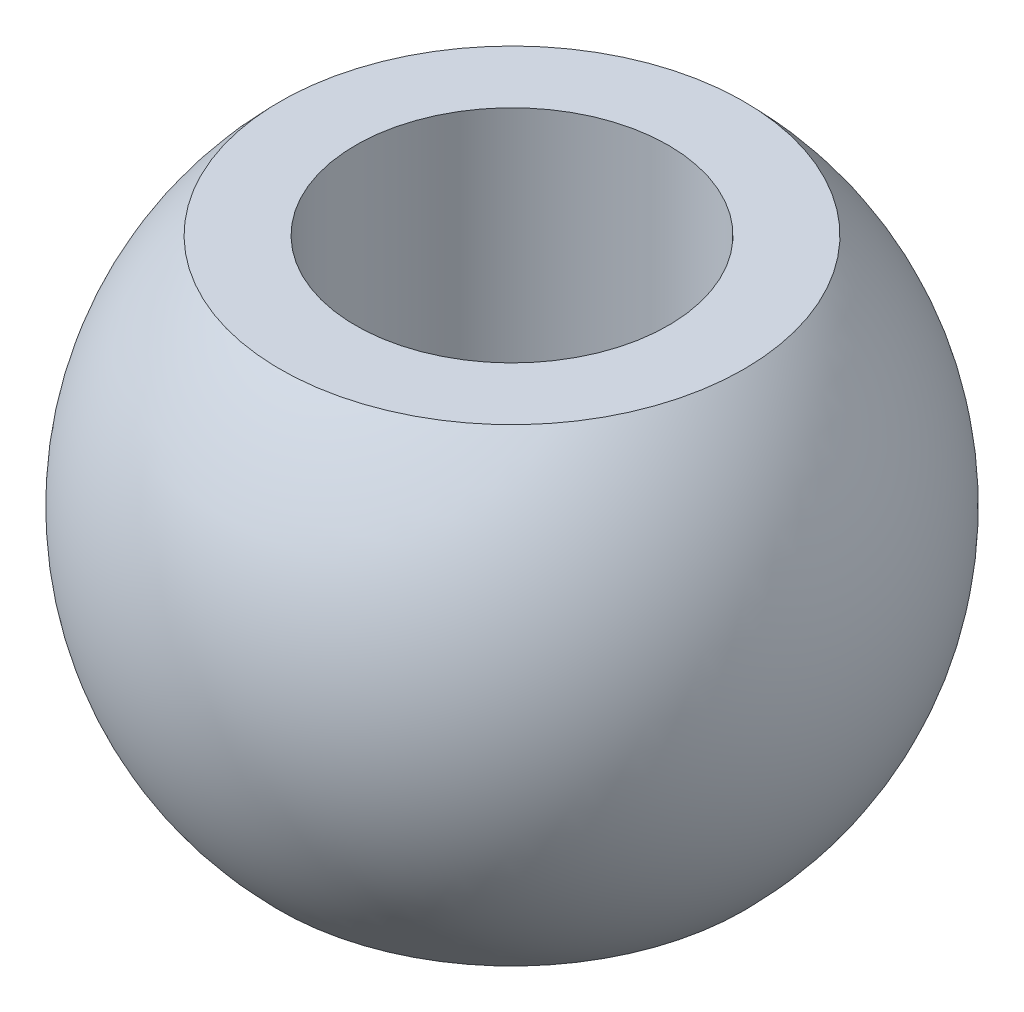
ISO-10303-21;
HEADER;
FILE_DESCRIPTION(('STEP AP214'),'2;1');
FILE_NAME('part.step','',(''),(''),'','','');
FILE_SCHEMA(('AUTOMOTIVE_DESIGN { 1 0 10303 214 1 1 1 1 }'));
ENDSEC;
DATA;
#1=APPLICATION_CONTEXT('core data for automotive mechanical design processes');
#2=APPLICATION_PROTOCOL_DEFINITION('international standard','automotive_design',2000,#1);
#3=PRODUCT_CONTEXT('',#1,'mechanical');
#4=PRODUCT('Part','Part','',(#3));
#5=PRODUCT_RELATED_PRODUCT_CATEGORY('part','',(#4));
#6=PRODUCT_DEFINITION_FORMATION('','',#4);
#7=PRODUCT_DEFINITION_CONTEXT('part definition',#1,'design');
#8=PRODUCT_DEFINITION('design','',#6,#7);
#9=PRODUCT_DEFINITION_SHAPE('','',#8);
#10=(LENGTH_UNIT() NAMED_UNIT(*) SI_UNIT(.MILLI.,.METRE.));
#11=(NAMED_UNIT(*) PLANE_ANGLE_UNIT() SI_UNIT($,.RADIAN.));
#12=(NAMED_UNIT(*) SI_UNIT($,.STERADIAN.) SOLID_ANGLE_UNIT());
#13=UNCERTAINTY_MEASURE_WITH_UNIT(LENGTH_MEASURE(1.E-05),#10,'distance_accuracy_value','');
#14=(GEOMETRIC_REPRESENTATION_CONTEXT(3) GLOBAL_UNCERTAINTY_ASSIGNED_CONTEXT((#13)) GLOBAL_UNIT_ASSIGNED_CONTEXT((#10,
#11,#12)) REPRESENTATION_CONTEXT('',''));
#15=CARTESIAN_POINT('',(0.,0.,0.));
#16=DIRECTION('',(0.,0.,1.));
#17=DIRECTION('',(1.,0.,0.));
#18=AXIS2_PLACEMENT_3D('',#15,#16,#17);
#19=CARTESIAN_POINT('',(3.,-4.5,0.));
#20=DIRECTION('',(0.,-1.,0.));
#21=DIRECTION('',(0.,0.,-1.));
#22=AXIS2_PLACEMENT_3D('',#19,#20,#21);
#23=PLANE('',#22);
#24=CARTESIAN_POINT('',(0.,-4.5,0.));
#25=DIRECTION('',(0.,-1.,0.));
#26=DIRECTION('',(0.,0.,-1.));
#27=AXIS2_PLACEMENT_3D('',#24,#25,#26);
#28=CIRCLE('',#27,4.45184231526679);
#29=CARTESIAN_POINT('',(4.45184231526679,-4.5,0.));
#30=VERTEX_POINT('',#29);
#31=EDGE_CURVE('E10',#30,#30,#28,.T.);
#32=ORIENTED_EDGE('',*,*,#31,.T.);
#33=EDGE_LOOP('',(#32));
#34=FACE_BOUND('',#33,.T.);
#35=CARTESIAN_POINT('',(0.,-4.5,0.));
#36=DIRECTION('',(0.,-1.,0.));
#37=DIRECTION('',(0.,0.,-1.));
#38=AXIS2_PLACEMENT_3D('',#35,#36,#37);
#39=CIRCLE('',#38,3.);
#40=CARTESIAN_POINT('',(0.,-4.5,-3.));
#41=VERTEX_POINT('',#40);
#42=EDGE_CURVE('E45',#41,#41,#39,.T.);
#43=ORIENTED_EDGE('',*,*,#42,.F.);
#44=EDGE_LOOP('',(#43));
#45=FACE_BOUND('',#44,.T.);
#46=ADVANCED_FACE('F31',(#34,#45),#23,.T.);
#47=CARTESIAN_POINT('',(0.,0.,0.));
#48=DIRECTION('',(0.,-1.,0.));
#49=DIRECTION('',(1.,0.,0.));
#50=AXIS2_PLACEMENT_3D('',#47,#48,#49);
#51=SPHERICAL_SURFACE('',#50,6.33);
#52=CARTESIAN_POINT('',(0.,4.5,0.));
#53=DIRECTION('',(0.,-1.,0.));
#54=DIRECTION('',(0.,0.,-1.));
#55=AXIS2_PLACEMENT_3D('',#52,#53,#54);
#56=CIRCLE('',#55,4.45184231526679);
#57=CARTESIAN_POINT('',(4.45184231526679,4.5,0.));
#58=VERTEX_POINT('',#57);
#59=EDGE_CURVE('E37',#58,#58,#56,.T.);
#60=CARTESIAN_POINT('',(4.45184231526679,4.5,0.));
#61=CARTESIAN_POINT('',(4.52597939429225,4.42665949036943,0.));
#62=CARTESIAN_POINT('',(4.59830080232891,4.35148394382566,0.));
#63=CARTESIAN_POINT('',(4.73914297379126,4.19765307272721,0.));
#64=CARTESIAN_POINT('',(4.80766373721695,4.11899774817253,0.));
#65=CARTESIAN_POINT('',(4.94073531682402,3.95839761686769,0.));
#66=CARTESIAN_POINT('',(5.00528613300538,3.87645281011754,0.));
#67=CARTESIAN_POINT('',(5.13026069796234,3.70947432091002,0.));
#68=CARTESIAN_POINT('',(5.19068444673794,3.62444063845266,0.));
#69=CARTESIAN_POINT('',(5.30725716941753,3.45149193780831,0.));
#70=CARTESIAN_POINT('',(5.36340614332153,3.36357691962133,0.));
#71=CARTESIAN_POINT('',(5.47129222719462,3.18508028777123,0.));
#72=CARTESIAN_POINT('',(5.52302933716373,3.09449867410812,0.));
#73=CARTESIAN_POINT('',(5.62196533089388,2.91089006010114,0.));
#74=CARTESIAN_POINT('',(5.66916421465493,2.81786305975729,0.));
#75=CARTESIAN_POINT('',(5.75890848975401,2.62959086503575,0.));
#76=CARTESIAN_POINT('',(5.80145388109204,2.53434567065808,0.));
#77=CARTESIAN_POINT('',(5.88178726643537,2.34186969463521,0.));
#78=CARTESIAN_POINT('',(5.91957526044067,2.24463891299001,0.));
#79=CARTESIAN_POINT('',(5.99030156562597,2.04842921923438,0.));
#80=CARTESIAN_POINT('',(6.02323987680597,1.94945030712395,0.));
#81=CARTESIAN_POINT('',(6.08418637447734,1.74998607829152,0.));
#82=CARTESIAN_POINT('',(6.11219456096871,1.64950076156952,0.));
#83=CARTESIAN_POINT('',(6.1632124077963,1.44726912836343,0.));
#84=CARTESIAN_POINT('',(6.18622206813252,1.34552281187933,0.));
#85=CARTESIAN_POINT('',(6.22718666854607,1.14101766359085,0.));
#86=CARTESIAN_POINT('',(6.24514160862339,1.03825883178646,0.));
#87=CARTESIAN_POINT('',(6.27595291903765,0.831979610064384,0.));
#88=CARTESIAN_POINT('',(6.28880928937458,0.728459220146696,0.));
#89=CARTESIAN_POINT('',(6.3093920625318,0.520909699278019,0.));
#90=CARTESIAN_POINT('',(6.31711846535209,0.416880568327029,0.));
#91=CARTESIAN_POINT('',(6.32742243408619,0.208567624917359,0.));
#92=CARTESIAN_POINT('',(6.33,0.104283812458679,0.));
#93=CARTESIAN_POINT('',(6.33,-0.104283812458681,0.));
#94=CARTESIAN_POINT('',(6.32742243408619,-0.20856762491736,0.));
#95=CARTESIAN_POINT('',(6.31711846535209,-0.41688056832703,0.));
#96=CARTESIAN_POINT('',(6.30939206253179,-0.52090969927802,0.));
#97=CARTESIAN_POINT('',(6.28880928937458,-0.728459220146698,0.));
#98=CARTESIAN_POINT('',(6.27595291903765,-0.831979610064385,0.));
#99=CARTESIAN_POINT('',(6.2451416086234,-1.03825883178646,0.));
#100=CARTESIAN_POINT('',(6.22718666854607,-1.14101766359085,0.));
#101=CARTESIAN_POINT('',(6.18622206813252,-1.34552281187933,0.));
#102=CARTESIAN_POINT('',(6.1632124077963,-1.44726912836343,0.));
#103=CARTESIAN_POINT('',(6.11219456096871,-1.64950076156952,0.));
#104=CARTESIAN_POINT('',(6.08418637447734,-1.74998607829152,0.));
#105=CARTESIAN_POINT('',(6.02323987680597,-1.94945030712395,0.));
#106=CARTESIAN_POINT('',(5.99030156562597,-2.04842921923438,0.));
#107=CARTESIAN_POINT('',(5.91957526044067,-2.24463891299001,0.));
#108=CARTESIAN_POINT('',(5.88178726643537,-2.34186969463521,0.));
#109=CARTESIAN_POINT('',(5.80145388109204,-2.53434567065808,0.));
#110=CARTESIAN_POINT('',(5.75890848975401,-2.62959086503576,0.));
#111=CARTESIAN_POINT('',(5.66916421465493,-2.81786305975729,0.));
#112=CARTESIAN_POINT('',(5.62196533089388,-2.91089006010115,0.));
#113=CARTESIAN_POINT('',(5.52302933716373,-3.09449867410812,0.));
#114=CARTESIAN_POINT('',(5.47129222719462,-3.18508028777124,0.));
#115=CARTESIAN_POINT('',(5.36340614332153,-3.36357691962133,0.));
#116=CARTESIAN_POINT('',(5.30725716941753,-3.45149193780831,0.));
#117=CARTESIAN_POINT('',(5.19068444673794,-3.62444063845266,0.));
#118=CARTESIAN_POINT('',(5.13026069796234,-3.70947432091002,0.));
#119=CARTESIAN_POINT('',(5.00528613300538,-3.87645281011754,0.));
#120=CARTESIAN_POINT('',(4.94073531682401,-3.95839761686769,0.));
#121=CARTESIAN_POINT('',(4.80766373721695,-4.11899774817253,0.));
#122=CARTESIAN_POINT('',(4.73914297379126,-4.19765307272721,0.));
#123=CARTESIAN_POINT('',(4.59830080232891,-4.35148394382566,0.));
#124=CARTESIAN_POINT('',(4.52597939429225,-4.42665949036943,0.));
#125=CARTESIAN_POINT('',(4.45184231526679,-4.5,0.));
#126=B_SPLINE_CURVE_WITH_KNOTS('',3,(#60,#61,#62,#63,#64,#65,#66,#67,#68,#69,#70,#71,#72,#73,
#74,#75,#76,#77,#78,#79,#80,#81,#82,#83,#84,#85,#86,#87,#88,#89,#90,#91,#92,#93,#94,#95,#96,#97,
#98,#99,#100,#101,#102,#103,#104,#105,#106,#107,#108,#109,#110,#111,#112,#113,#114,#115,#116,
#117,#118,#119,#120,#121,#122,#123,#124,#125),.UNSPECIFIED.,.F.,.F.,(4,2,2,2,2,2,2,2,2,2,2,2,2,
2,2,2,2,2,2,2,2,2,2,2,2,2,2,2,2,2,2,2,4),(0.,0.312819607051271,0.625639214102543,
0.938458821153815,1.25127842820509,1.56409803525636,1.87691764230763,2.1897372493589,
2.50255685641018,2.81537646346145,3.12819607051272,3.44101567756399,3.75383528461526,
4.06665489166653,4.37947449871781,4.69229410576908,5.00511371282035,5.31793331987162,
5.63075292692289,5.94357253397417,6.25639214102544,6.56921174807671,6.88203135512798,
7.19485096217925,7.50767056923053,7.8204901762818,8.13330978333307,8.44612939038434,
8.75894899743561,9.07176860448689,9.38458821153816,9.69740781858943,10.0102274256407),.UNSPECIFIED.);
#127=EDGE_CURVE('BSEAM55',#58,#30,#126,.T.);
#128=ORIENTED_EDGE('',*,*,#59,.T.);
#129=ORIENTED_EDGE('',*,*,#31,.F.);
#130=ORIENTED_EDGE('',*,*,#127,.T.);
#131=ORIENTED_EDGE('',*,*,#127,.F.);
#132=EDGE_LOOP('',(#128,#130,#129,#131));
#133=FACE_BOUND('',#132,.T.);
#134=ADVANCED_FACE('F55',(#133),#51,.T.);
#135=CARTESIAN_POINT('',(3.,4.5,0.));
#136=DIRECTION('',(0.,1.,0.));
#137=DIRECTION('',(0.,0.,1.));
#138=AXIS2_PLACEMENT_3D('',#135,#136,#137);
#139=PLANE('',#138);
#140=CARTESIAN_POINT('',(0.,4.5,0.));
#141=DIRECTION('',(0.,-1.,0.));
#142=DIRECTION('',(0.,0.,-1.));
#143=AXIS2_PLACEMENT_3D('',#140,#141,#142);
#144=CIRCLE('',#143,3.);
#145=CARTESIAN_POINT('',(0.,4.5,-3.));
#146=VERTEX_POINT('',#145);
#147=EDGE_CURVE('E41',#146,#146,#144,.T.);
#148=ORIENTED_EDGE('',*,*,#147,.T.);
#149=EDGE_LOOP('',(#148));
#150=FACE_BOUND('',#149,.T.);
#151=ORIENTED_EDGE('',*,*,#59,.F.);
#152=EDGE_LOOP('',(#151));
#153=FACE_BOUND('',#152,.T.);
#154=ADVANCED_FACE('F59',(#150,#153),#139,.T.);
#155=CARTESIAN_POINT('',(0.,-11.1,0.));
#156=DIRECTION('',(0.,-1.,0.));
#157=DIRECTION('',(0.,0.,-1.));
#158=AXIS2_PLACEMENT_3D('',#155,#156,#157);
#159=CYLINDRICAL_SURFACE('',#158,3.);
#160=ORIENTED_EDGE('',*,*,#42,.T.);
#161=EDGE_LOOP('',(#160));
#162=FACE_BOUND('',#161,.T.);
#163=ORIENTED_EDGE('',*,*,#147,.F.);
#164=EDGE_LOOP('',(#163));
#165=FACE_BOUND('',#164,.T.);
#166=ADVANCED_FACE('F51',(#162,#165),#159,.F.);
#167=CLOSED_SHELL('',(#46,#134,#154,#166));
#168=MANIFOLD_SOLID_BREP('B2',#167);
#169=ADVANCED_BREP_SHAPE_REPRESENTATION('',(#18,#168),#14);
#170=SHAPE_DEFINITION_REPRESENTATION(#9,#169);
ENDSEC;
END-ISO-10303-21;
